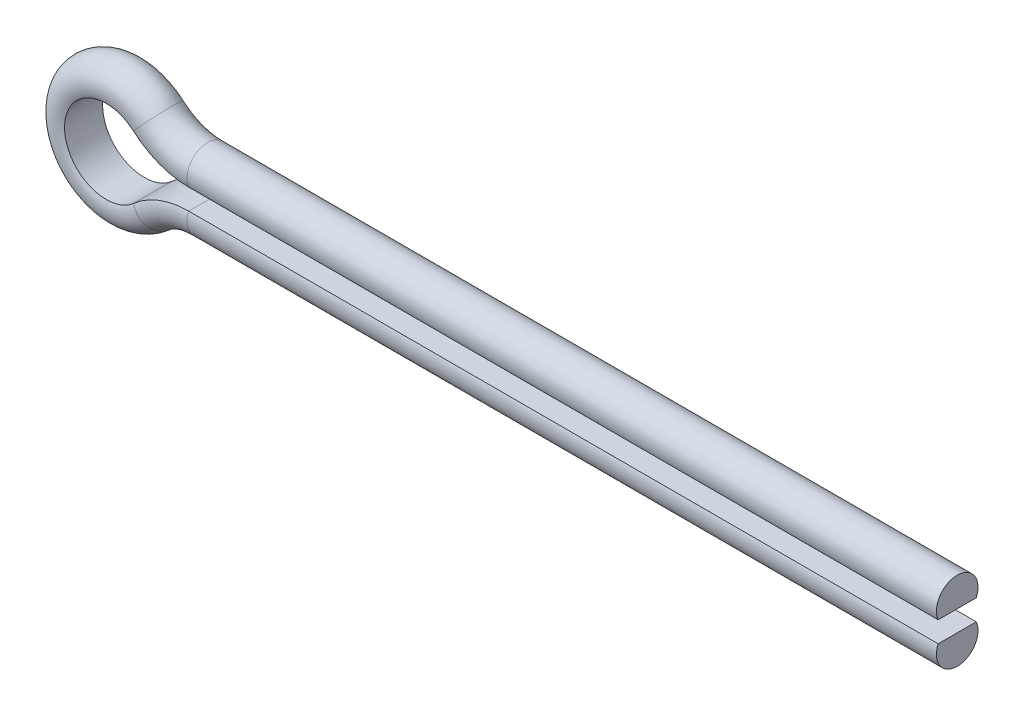
ISO-10303-21;
HEADER;
FILE_DESCRIPTION(('STEP AP214'),'2;1');
FILE_NAME('part.step','',(''),(''),'','','');
FILE_SCHEMA(('AUTOMOTIVE_DESIGN { 1 0 10303 214 1 1 1 1 }'));
ENDSEC;
DATA;
#1=APPLICATION_CONTEXT('core data for automotive mechanical design processes');
#2=APPLICATION_PROTOCOL_DEFINITION('international standard','automotive_design',2000,#1);
#3=PRODUCT_CONTEXT('',#1,'mechanical');
#4=PRODUCT('Part','Part','',(#3));
#5=PRODUCT_RELATED_PRODUCT_CATEGORY('part','',(#4));
#6=PRODUCT_DEFINITION_FORMATION('','',#4);
#7=PRODUCT_DEFINITION_CONTEXT('part definition',#1,'design');
#8=PRODUCT_DEFINITION('design','',#6,#7);
#9=PRODUCT_DEFINITION_SHAPE('','',#8);
#10=(LENGTH_UNIT() NAMED_UNIT(*) SI_UNIT(.MILLI.,.METRE.));
#11=(NAMED_UNIT(*) PLANE_ANGLE_UNIT() SI_UNIT($,.RADIAN.));
#12=(NAMED_UNIT(*) SI_UNIT($,.STERADIAN.) SOLID_ANGLE_UNIT());
#13=UNCERTAINTY_MEASURE_WITH_UNIT(LENGTH_MEASURE(1.E-05),#10,'distance_accuracy_value','');
#14=(GEOMETRIC_REPRESENTATION_CONTEXT(3) GLOBAL_UNCERTAINTY_ASSIGNED_CONTEXT((#13)) GLOBAL_UNIT_ASSIGNED_CONTEXT((#10,
#11,#12)) REPRESENTATION_CONTEXT('',''));
#15=CARTESIAN_POINT('',(0.,0.,0.));
#16=DIRECTION('',(0.,0.,1.));
#17=DIRECTION('',(1.,0.,0.));
#18=AXIS2_PLACEMENT_3D('',#15,#16,#17);
#19=CARTESIAN_POINT('',(100.,-2.25,0.));
#20=DIRECTION('',(-1.,0.,0.));
#21=DIRECTION('',(0.,-1.,0.));
#22=AXIS2_PLACEMENT_3D('',#19,#20,#21);
#23=PLANE('',#22);
#24=CARTESIAN_POINT('',(100.,-2.25,0.));
#25=DIRECTION('',(-1.,0.,0.));
#26=DIRECTION('',(0.,-1.,0.));
#27=AXIS2_PLACEMENT_3D('',#24,#25,#26);
#28=CIRCLE('',#27,2.5);
#29=CARTESIAN_POINT('',(100.,-1.25,-2.29128784747792));
#30=VERTEX_POINT('',#29);
#31=CARTESIAN_POINT('',(100.,-1.25,2.29128784747792));
#32=VERTEX_POINT('',#31);
#33=EDGE_CURVE('E82',#30,#32,#28,.T.);
#34=ORIENTED_EDGE('',*,*,#33,.F.);
#35=DIRECTION('',(0.,0.,-1.));
#36=VECTOR('',#35,1.);
#37=CARTESIAN_POINT('',(100.,-1.25,2.29128784747792));
#38=LINE('',#37,#36);
#39=EDGE_CURVE('E90',#32,#30,#38,.T.);
#40=ORIENTED_EDGE('',*,*,#39,.F.);
#41=EDGE_LOOP('',(#34,#40));
#42=FACE_BOUND('',#41,.T.);
#43=ADVANCED_FACE('F39',(#42),#23,.F.);
#44=CARTESIAN_POINT('',(100.,2.25,0.));
#45=DIRECTION('',(1.,0.,0.));
#46=DIRECTION('',(0.,1.,0.));
#47=AXIS2_PLACEMENT_3D('',#44,#45,#46);
#48=PLANE('',#47);
#49=CARTESIAN_POINT('',(100.,2.25,0.));
#50=DIRECTION('',(1.,0.,0.));
#51=DIRECTION('',(0.,1.,0.));
#52=AXIS2_PLACEMENT_3D('',#49,#50,#51);
#53=CIRCLE('',#52,2.5);
#54=CARTESIAN_POINT('',(100.,1.25,-2.29128784747792));
#55=VERTEX_POINT('',#54);
#56=CARTESIAN_POINT('',(100.,1.25,2.29128784747792));
#57=VERTEX_POINT('',#56);
#58=EDGE_CURVE('E51',#55,#57,#53,.T.);
#59=ORIENTED_EDGE('',*,*,#58,.T.);
#60=DIRECTION('',(0.,0.,-1.));
#61=VECTOR('',#60,1.);
#62=CARTESIAN_POINT('',(100.,1.25,2.29128784747792));
#63=LINE('',#62,#61);
#64=EDGE_CURVE('E11',#57,#55,#63,.T.);
#65=ORIENTED_EDGE('',*,*,#64,.T.);
#66=EDGE_LOOP('',(#59,#65));
#67=FACE_BOUND('',#66,.T.);
#68=ADVANCED_FACE('F189',(#67),#48,.T.);
#69=CARTESIAN_POINT('',(100.,-2.25,0.));
#70=DIRECTION('',(-1.,0.,0.));
#71=DIRECTION('',(0.,-1.,0.));
#72=AXIS2_PLACEMENT_3D('',#69,#70,#71);
#73=CYLINDRICAL_SURFACE('',#72,2.5);
#74=DIRECTION('',(-1.,0.,0.));
#75=VECTOR('',#74,1.);
#76=CARTESIAN_POINT('',(100.,-1.25,2.29128784747792));
#77=LINE('',#76,#75);
#78=CARTESIAN_POINT('',(9.92156741649222,-1.25,2.29128784747792));
#79=VERTEX_POINT('',#78);
#80=EDGE_CURVE('E97',#32,#79,#77,.T.);
#81=ORIENTED_EDGE('',*,*,#80,.T.);
#82=CARTESIAN_POINT('',(9.92156741649222,-2.25,0.));
#83=DIRECTION('',(-1.,0.,0.));
#84=DIRECTION('',(0.,-1.,0.));
#85=AXIS2_PLACEMENT_3D('',#82,#83,#84);
#86=CIRCLE('',#85,2.5);
#87=CARTESIAN_POINT('',(9.92156741649222,-1.25,-2.29128784747792));
#88=VERTEX_POINT('',#87);
#89=EDGE_CURVE('E104',#88,#79,#86,.T.);
#90=ORIENTED_EDGE('',*,*,#89,.F.);
#91=DIRECTION('',(-1.,0.,0.));
#92=VECTOR('',#91,1.);
#93=CARTESIAN_POINT('',(100.,-1.25,-2.29128784747792));
#94=LINE('',#93,#92);
#95=EDGE_CURVE('E100',#30,#88,#94,.T.);
#96=ORIENTED_EDGE('',*,*,#95,.F.);
#97=ORIENTED_EDGE('',*,*,#33,.T.);
#98=EDGE_LOOP('',(#81,#90,#96,#97));
#99=FACE_BOUND('',#98,.T.);
#100=ADVANCED_FACE('F102',(#99),#73,.T.);
#101=CARTESIAN_POINT('',(100.,-1.25,2.29128784747792));
#102=DIRECTION('',(0.,1.,0.));
#103=DIRECTION('',(-1.,0.,0.));
#104=AXIS2_PLACEMENT_3D('',#101,#102,#103);
#105=PLANE('',#104);
#106=DIRECTION('',(0.,0.,-1.));
#107=VECTOR('',#106,1.);
#108=CARTESIAN_POINT('',(9.92156741649222,-1.25,2.29128784747792));
#109=LINE('',#108,#107);
#110=EDGE_CURVE('E119',#79,#88,#109,.T.);
#111=ORIENTED_EDGE('',*,*,#110,.F.);
#112=ORIENTED_EDGE('',*,*,#80,.F.);
#113=ORIENTED_EDGE('',*,*,#39,.T.);
#114=ORIENTED_EDGE('',*,*,#95,.T.);
#115=EDGE_LOOP('',(#111,#112,#113,#114));
#116=FACE_BOUND('',#115,.T.);
#117=ADVANCED_FACE('F96',(#116),#105,.T.);
#118=CARTESIAN_POINT('',(9.92156741649221,-11.25,0.));
#119=DIRECTION('',(0.,0.,1.));
#120=DIRECTION('',(1.,0.,0.));
#121=AXIS2_PLACEMENT_3D('',#118,#119,#120);
#122=TOROIDAL_SURFACE('',#121,9.,2.5);
#123=CARTESIAN_POINT('',(9.92156741649221,-11.25,2.29128784747792));
#124=DIRECTION('',(0.,0.,1.));
#125=DIRECTION('',(0.,1.,0.));
#126=AXIS2_PLACEMENT_3D('',#123,#124,#125);
#127=CIRCLE('',#126,10.);
#128=CARTESIAN_POINT('',(3.30718913883074,-3.75,2.29128784747792));
#129=VERTEX_POINT('',#128);
#130=EDGE_CURVE('E112',#79,#129,#127,.T.);
#131=ORIENTED_EDGE('',*,*,#130,.T.);
#132=CARTESIAN_POINT('',(3.96862696659689,-4.5,0.));
#133=DIRECTION('',(-0.75,-0.661437827766148,0.));
#134=DIRECTION('',(0.661437827766148,-0.75,0.));
#135=AXIS2_PLACEMENT_3D('',#132,#133,#134);
#136=CIRCLE('',#135,2.5);
#137=CARTESIAN_POINT('',(3.30718913883074,-3.75,-2.29128784747792));
#138=VERTEX_POINT('',#137);
#139=EDGE_CURVE('E109',#138,#129,#136,.T.);
#140=ORIENTED_EDGE('',*,*,#139,.F.);
#141=CARTESIAN_POINT('',(9.92156741649221,-11.25,-2.29128784747792));
#142=DIRECTION('',(0.,0.,1.));
#143=DIRECTION('',(0.,1.,0.));
#144=AXIS2_PLACEMENT_3D('',#141,#142,#143);
#145=CIRCLE('',#144,10.);
#146=EDGE_CURVE('E115',#88,#138,#145,.T.);
#147=ORIENTED_EDGE('',*,*,#146,.F.);
#148=ORIENTED_EDGE('',*,*,#89,.T.);
#149=EDGE_LOOP('',(#131,#140,#147,#148));
#150=FACE_BOUND('',#149,.T.);
#151=ADVANCED_FACE('F169',(#150),#122,.T.);
#152=CARTESIAN_POINT('',(9.92156741649221,-11.25,0.));
#153=DIRECTION('',(0.,0.,1.));
#154=DIRECTION('',(1.,0.,0.));
#155=AXIS2_PLACEMENT_3D('',#152,#153,#154);
#156=CYLINDRICAL_SURFACE('',#155,10.);
#157=DIRECTION('',(0.,0.,-1.));
#158=VECTOR('',#157,1.);
#159=CARTESIAN_POINT('',(3.30718913883074,-3.75,2.29128784747792));
#160=LINE('',#159,#158);
#161=EDGE_CURVE('E113',#129,#138,#160,.T.);
#162=ORIENTED_EDGE('',*,*,#161,.F.);
#163=ORIENTED_EDGE('',*,*,#130,.F.);
#164=ORIENTED_EDGE('',*,*,#110,.T.);
#165=ORIENTED_EDGE('',*,*,#146,.T.);
#166=EDGE_LOOP('',(#162,#163,#164,#165));
#167=FACE_BOUND('',#166,.T.);
#168=ADVANCED_FACE('F173',(#167),#156,.T.);
#169=CARTESIAN_POINT('',(0.,0.,0.));
#170=DIRECTION('',(0.,0.,-1.));
#171=DIRECTION('',(-1.,0.,0.));
#172=AXIS2_PLACEMENT_3D('',#169,#170,#171);
#173=TOROIDAL_SURFACE('',#172,6.00000000000001,2.5);
#174=CARTESIAN_POINT('',(0.,0.,2.29128784747792));
#175=DIRECTION('',(0.,0.,-1.));
#176=DIRECTION('',(0.661437827766148,-0.75,0.));
#177=AXIS2_PLACEMENT_3D('',#174,#175,#176);
#178=CIRCLE('',#177,5.);
#179=CARTESIAN_POINT('',(3.30718913883074,3.75,2.29128784747792));
#180=VERTEX_POINT('',#179);
#181=EDGE_CURVE('E122',#129,#180,#178,.T.);
#182=ORIENTED_EDGE('',*,*,#181,.T.);
#183=CARTESIAN_POINT('',(3.96862696659689,4.5,0.));
#184=DIRECTION('',(0.749999999999999,-0.661437827766148,0.));
#185=DIRECTION('',(0.661437827766149,0.749999999999999,0.));
#186=AXIS2_PLACEMENT_3D('',#183,#184,#185);
#187=CIRCLE('',#186,2.5);
#188=CARTESIAN_POINT('',(3.30718913883074,3.75,-2.29128784747792));
#189=VERTEX_POINT('',#188);
#190=EDGE_CURVE('E118',#189,#180,#187,.T.);
#191=ORIENTED_EDGE('',*,*,#190,.F.);
#192=CARTESIAN_POINT('',(0.,0.,-2.29128784747792));
#193=DIRECTION('',(0.,0.,-1.));
#194=DIRECTION('',(0.661437827766148,-0.75,0.));
#195=AXIS2_PLACEMENT_3D('',#192,#193,#194);
#196=CIRCLE('',#195,5.);
#197=EDGE_CURVE('E121',#138,#189,#196,.T.);
#198=ORIENTED_EDGE('',*,*,#197,.F.);
#199=ORIENTED_EDGE('',*,*,#139,.T.);
#200=EDGE_LOOP('',(#182,#191,#198,#199));
#201=FACE_BOUND('',#200,.T.);
#202=ADVANCED_FACE('F163',(#201),#173,.T.);
#203=CARTESIAN_POINT('',(0.,0.,0.));
#204=DIRECTION('',(0.,0.,-1.));
#205=DIRECTION('',(-1.,0.,0.));
#206=AXIS2_PLACEMENT_3D('',#203,#204,#205);
#207=CYLINDRICAL_SURFACE('',#206,5.);
#208=DIRECTION('',(0.,0.,-1.));
#209=VECTOR('',#208,1.);
#210=CARTESIAN_POINT('',(3.30718913883074,3.75,2.29128784747792));
#211=LINE('',#210,#209);
#212=EDGE_CURVE('E128',#180,#189,#211,.T.);
#213=ORIENTED_EDGE('',*,*,#212,.F.);
#214=ORIENTED_EDGE('',*,*,#181,.F.);
#215=ORIENTED_EDGE('',*,*,#161,.T.);
#216=ORIENTED_EDGE('',*,*,#197,.T.);
#217=EDGE_LOOP('',(#213,#214,#215,#216));
#218=FACE_BOUND('',#217,.T.);
#219=ADVANCED_FACE('F165',(#218),#207,.F.);
#220=CARTESIAN_POINT('',(9.92156741649221,11.25,0.));
#221=DIRECTION('',(0.,0.,1.));
#222=DIRECTION('',(1.,0.,0.));
#223=AXIS2_PLACEMENT_3D('',#220,#221,#222);
#224=TOROIDAL_SURFACE('',#223,8.99999999999999,2.5);
#225=CARTESIAN_POINT('',(9.92156741649221,11.25,2.29128784747792));
#226=DIRECTION('',(0.,0.,1.));
#227=DIRECTION('',(-0.661437827766148,-0.75,0.));
#228=AXIS2_PLACEMENT_3D('',#225,#226,#227);
#229=CIRCLE('',#228,9.99999999999999);
#230=CARTESIAN_POINT('',(9.92156741649222,1.25,2.29128784747792));
#231=VERTEX_POINT('',#230);
#232=EDGE_CURVE('E135',#180,#231,#229,.T.);
#233=ORIENTED_EDGE('',*,*,#232,.T.);
#234=CARTESIAN_POINT('',(9.92156741649222,2.25,0.));
#235=DIRECTION('',(1.,0.,0.));
#236=DIRECTION('',(0.,1.,0.));
#237=AXIS2_PLACEMENT_3D('',#234,#235,#236);
#238=CIRCLE('',#237,2.5);
#239=CARTESIAN_POINT('',(9.92156741649222,1.25,-2.29128784747792));
#240=VERTEX_POINT('',#239);
#241=EDGE_CURVE('E129',#240,#231,#238,.T.);
#242=ORIENTED_EDGE('',*,*,#241,.F.);
#243=CARTESIAN_POINT('',(9.92156741649221,11.25,-2.29128784747792));
#244=DIRECTION('',(0.,0.,1.));
#245=DIRECTION('',(-0.661437827766148,-0.75,0.));
#246=AXIS2_PLACEMENT_3D('',#243,#244,#245);
#247=CIRCLE('',#246,9.99999999999999);
#248=EDGE_CURVE('E133',#189,#240,#247,.T.);
#249=ORIENTED_EDGE('',*,*,#248,.F.);
#250=ORIENTED_EDGE('',*,*,#190,.T.);
#251=EDGE_LOOP('',(#233,#242,#249,#250));
#252=FACE_BOUND('',#251,.T.);
#253=ADVANCED_FACE('F160',(#252),#224,.T.);
#254=CARTESIAN_POINT('',(9.92156741649221,11.25,0.));
#255=DIRECTION('',(0.,0.,1.));
#256=DIRECTION('',(1.,0.,0.));
#257=AXIS2_PLACEMENT_3D('',#254,#255,#256);
#258=CYLINDRICAL_SURFACE('',#257,9.99999999999999);
#259=DIRECTION('',(0.,0.,-1.));
#260=VECTOR('',#259,1.);
#261=CARTESIAN_POINT('',(9.92156741649222,1.25,2.29128784747792));
#262=LINE('',#261,#260);
#263=EDGE_CURVE('E136',#231,#240,#262,.T.);
#264=ORIENTED_EDGE('',*,*,#263,.F.);
#265=ORIENTED_EDGE('',*,*,#232,.F.);
#266=ORIENTED_EDGE('',*,*,#212,.T.);
#267=ORIENTED_EDGE('',*,*,#248,.T.);
#268=EDGE_LOOP('',(#264,#265,#266,#267));
#269=FACE_BOUND('',#268,.T.);
#270=ADVANCED_FACE('F159',(#269),#258,.T.);
#271=CARTESIAN_POINT('',(9.92156741649222,2.25,0.));
#272=DIRECTION('',(1.,0.,0.));
#273=DIRECTION('',(0.,1.,0.));
#274=AXIS2_PLACEMENT_3D('',#271,#272,#273);
#275=CYLINDRICAL_SURFACE('',#274,2.5);
#276=DIRECTION('',(1.,0.,0.));
#277=VECTOR('',#276,1.);
#278=CARTESIAN_POINT('',(9.92156741649222,1.25,2.29128784747792));
#279=LINE('',#278,#277);
#280=EDGE_CURVE('E46',#231,#57,#279,.T.);
#281=ORIENTED_EDGE('',*,*,#280,.T.);
#282=ORIENTED_EDGE('',*,*,#58,.F.);
#283=DIRECTION('',(1.,0.,0.));
#284=VECTOR('',#283,1.);
#285=CARTESIAN_POINT('',(9.92156741649222,1.25,-2.29128784747792));
#286=LINE('',#285,#284);
#287=EDGE_CURVE('E139',#240,#55,#286,.T.);
#288=ORIENTED_EDGE('',*,*,#287,.F.);
#289=ORIENTED_EDGE('',*,*,#241,.T.);
#290=EDGE_LOOP('',(#281,#282,#288,#289));
#291=FACE_BOUND('',#290,.T.);
#292=ADVANCED_FACE('F183',(#291),#275,.T.);
#293=CARTESIAN_POINT('',(9.92156741649222,1.25,2.29128784747792));
#294=DIRECTION('',(0.,-1.,0.));
#295=DIRECTION('',(1.,0.,0.));
#296=AXIS2_PLACEMENT_3D('',#293,#294,#295);
#297=PLANE('',#296);
#298=ORIENTED_EDGE('',*,*,#64,.F.);
#299=ORIENTED_EDGE('',*,*,#280,.F.);
#300=ORIENTED_EDGE('',*,*,#263,.T.);
#301=ORIENTED_EDGE('',*,*,#287,.T.);
#302=EDGE_LOOP('',(#298,#299,#300,#301));
#303=FACE_BOUND('',#302,.T.);
#304=ADVANCED_FACE('F153',(#303),#297,.T.);
#305=CLOSED_SHELL('',(#43,#68,#100,#117,#151,#168,#202,#219,#253,#270,#292,#304));
#306=MANIFOLD_SOLID_BREP('B2',#305);
#307=ADVANCED_BREP_SHAPE_REPRESENTATION('',(#18,#306),#14);
#308=SHAPE_DEFINITION_REPRESENTATION(#9,#307);
ENDSEC;
END-ISO-10303-21;
